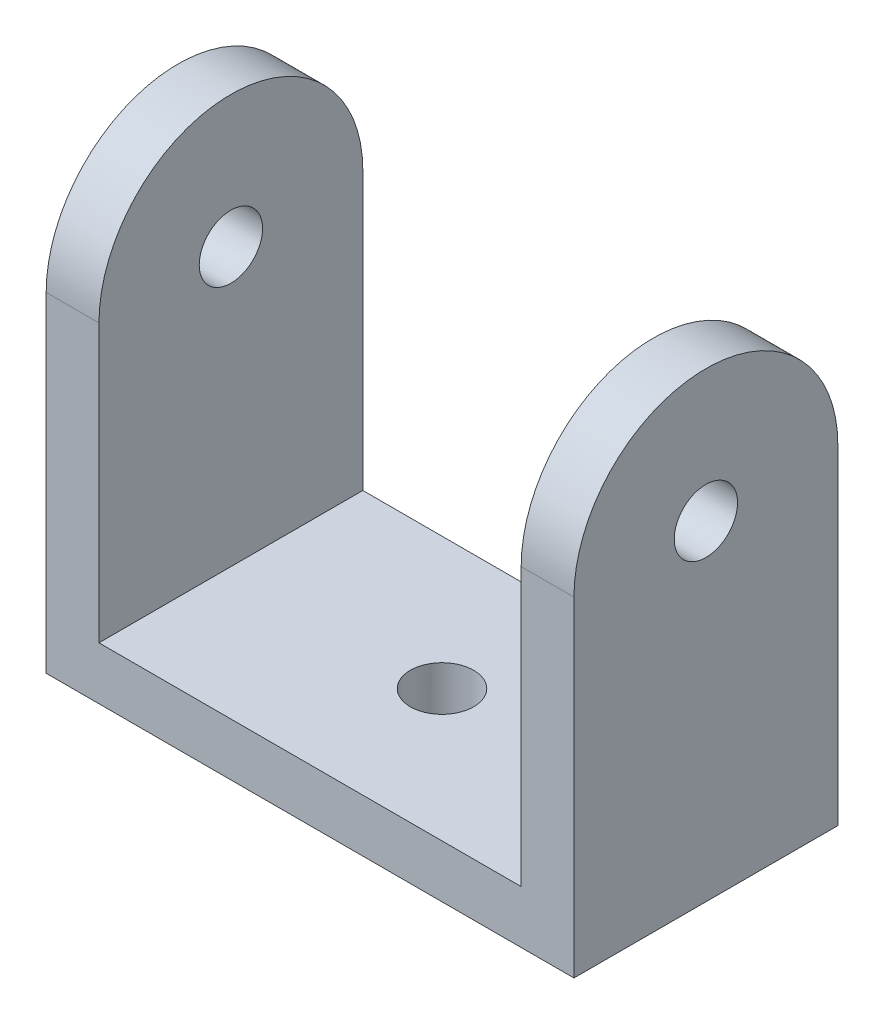
ISO-10303-21;
HEADER;
FILE_DESCRIPTION(('STEP AP214'),'2;1');
FILE_NAME('part.step','',(''),(''),'','','');
FILE_SCHEMA(('AUTOMOTIVE_DESIGN { 1 0 10303 214 1 1 1 1 }'));
ENDSEC;
DATA;
#1=APPLICATION_CONTEXT('core data for automotive mechanical design processes');
#2=APPLICATION_PROTOCOL_DEFINITION('international standard','automotive_design',2000,#1);
#3=PRODUCT_CONTEXT('',#1,'mechanical');
#4=PRODUCT('Part','Part','',(#3));
#5=PRODUCT_RELATED_PRODUCT_CATEGORY('part','',(#4));
#6=PRODUCT_DEFINITION_FORMATION('','',#4);
#7=PRODUCT_DEFINITION_CONTEXT('part definition',#1,'design');
#8=PRODUCT_DEFINITION('design','',#6,#7);
#9=PRODUCT_DEFINITION_SHAPE('','',#8);
#10=(LENGTH_UNIT() NAMED_UNIT(*) SI_UNIT(.MILLI.,.METRE.));
#11=(NAMED_UNIT(*) PLANE_ANGLE_UNIT() SI_UNIT($,.RADIAN.));
#12=(NAMED_UNIT(*) SI_UNIT($,.STERADIAN.) SOLID_ANGLE_UNIT());
#13=UNCERTAINTY_MEASURE_WITH_UNIT(LENGTH_MEASURE(1.E-05),#10,'distance_accuracy_value','');
#14=(GEOMETRIC_REPRESENTATION_CONTEXT(3) GLOBAL_UNCERTAINTY_ASSIGNED_CONTEXT((#13)) GLOBAL_UNIT_ASSIGNED_CONTEXT((#10,
#11,#12)) REPRESENTATION_CONTEXT('',''));
#15=CARTESIAN_POINT('',(0.,0.,0.));
#16=DIRECTION('',(0.,0.,1.));
#17=DIRECTION('',(1.,0.,0.));
#18=AXIS2_PLACEMENT_3D('',#15,#16,#17);
#19=CARTESIAN_POINT('',(20.,-25.,-10.));
#20=DIRECTION('',(0.,1.,0.));
#21=DIRECTION('',(0.,0.,1.));
#22=AXIS2_PLACEMENT_3D('',#19,#20,#21);
#23=PLANE('',#22);
#24=DIRECTION('',(0.,0.,-1.));
#25=VECTOR('',#24,1.);
#26=CARTESIAN_POINT('',(-20.,-25.,-10.));
#27=LINE('',#26,#25);
#28=CARTESIAN_POINT('',(-20.,-25.,10.));
#29=VERTEX_POINT('',#28);
#30=CARTESIAN_POINT('',(-20.,-25.,-10.));
#31=VERTEX_POINT('',#30);
#32=EDGE_CURVE('E163',#29,#31,#27,.T.);
#33=ORIENTED_EDGE('',*,*,#32,.T.);
#34=DIRECTION('',(-1.,0.,0.));
#35=VECTOR('',#34,1.);
#36=CARTESIAN_POINT('',(20.,-25.,-10.));
#37=LINE('',#36,#35);
#38=CARTESIAN_POINT('',(20.,-25.,-10.));
#39=VERTEX_POINT('',#38);
#40=EDGE_CURVE('E168',#39,#31,#37,.T.);
#41=ORIENTED_EDGE('',*,*,#40,.F.);
#42=DIRECTION('',(0.,0.,-1.));
#43=VECTOR('',#42,1.);
#44=CARTESIAN_POINT('',(20.,-25.,-10.));
#45=LINE('',#44,#43);
#46=CARTESIAN_POINT('',(20.,-25.,10.));
#47=VERTEX_POINT('',#46);
#48=EDGE_CURVE('E158',#47,#39,#45,.T.);
#49=ORIENTED_EDGE('',*,*,#48,.F.);
#50=DIRECTION('',(-1.,0.,0.));
#51=VECTOR('',#50,1.);
#52=CARTESIAN_POINT('',(20.,-25.,10.));
#53=LINE('',#52,#51);
#54=EDGE_CURVE('E171',#47,#29,#53,.T.);
#55=ORIENTED_EDGE('',*,*,#54,.T.);
#56=EDGE_LOOP('',(#33,#41,#49,#55));
#57=FACE_BOUND('',#56,.T.);
#58=CARTESIAN_POINT('',(0.,-25.000012,0.));
#59=DIRECTION('',(0.,-1.,0.));
#60=DIRECTION('',(0.,0.,-1.));
#61=AXIS2_PLACEMENT_3D('',#58,#59,#60);
#62=CIRCLE('',#61,2.4);
#63=CARTESIAN_POINT('',(0.,-25.000012,-2.4));
#64=VERTEX_POINT('',#63);
#65=EDGE_CURVE('E185',#64,#64,#62,.T.);
#66=ORIENTED_EDGE('',*,*,#65,.F.);
#67=EDGE_LOOP('',(#66));
#68=FACE_BOUND('',#67,.T.);
#69=ADVANCED_FACE('F41',(#57,#68),#23,.F.);
#70=CARTESIAN_POINT('',(20.,0.,0.));
#71=DIRECTION('',(-1.,0.,0.));
#72=DIRECTION('',(0.,0.,1.));
#73=AXIS2_PLACEMENT_3D('',#70,#71,#72);
#74=CYLINDRICAL_SURFACE('',#73,10.);
#75=CARTESIAN_POINT('',(-16.,0.,0.));
#76=DIRECTION('',(-1.,0.,0.));
#77=DIRECTION('',(0.,0.,1.));
#78=AXIS2_PLACEMENT_3D('',#75,#76,#77);
#79=CIRCLE('',#78,10.);
#80=CARTESIAN_POINT('',(-16.,0.,-10.));
#81=VERTEX_POINT('',#80);
#82=CARTESIAN_POINT('',(-16.,0.,10.));
#83=VERTEX_POINT('',#82);
#84=EDGE_CURVE('E144',#81,#83,#79,.F.);
#85=ORIENTED_EDGE('',*,*,#84,.F.);
#86=DIRECTION('',(-1.,0.,0.));
#87=VECTOR('',#86,1.);
#88=CARTESIAN_POINT('',(20.,0.,-10.));
#89=LINE('',#88,#87);
#90=CARTESIAN_POINT('',(-20.,0.,-10.));
#91=VERTEX_POINT('',#90);
#92=EDGE_CURVE('E93',#81,#91,#89,.T.);
#93=ORIENTED_EDGE('',*,*,#92,.T.);
#94=CARTESIAN_POINT('',(-20.,0.,0.));
#95=DIRECTION('',(1.,0.,0.));
#96=DIRECTION('',(0.,0.,1.));
#97=AXIS2_PLACEMENT_3D('',#94,#95,#96);
#98=CIRCLE('',#97,10.);
#99=CARTESIAN_POINT('',(-20.,0.,10.));
#100=VERTEX_POINT('',#99);
#101=EDGE_CURVE('E147',#91,#100,#98,.T.);
#102=ORIENTED_EDGE('',*,*,#101,.T.);
#103=DIRECTION('',(-1.,0.,0.));
#104=VECTOR('',#103,1.);
#105=CARTESIAN_POINT('',(20.,0.,10.));
#106=LINE('',#105,#104);
#107=EDGE_CURVE('E55',#83,#100,#106,.T.);
#108=ORIENTED_EDGE('',*,*,#107,.F.);
#109=EDGE_LOOP('',(#85,#93,#102,#108));
#110=FACE_BOUND('',#109,.T.);
#111=ADVANCED_FACE('F234',(#110),#74,.T.);
#112=CARTESIAN_POINT('',(20.,-25.,10.));
#113=DIRECTION('',(0.,0.,-1.));
#114=DIRECTION('',(0.,1.,0.));
#115=AXIS2_PLACEMENT_3D('',#112,#113,#114);
#116=PLANE('',#115);
#117=DIRECTION('',(0.,-1.,0.));
#118=VECTOR('',#117,1.);
#119=CARTESIAN_POINT('',(-16.,0.,10.));
#120=LINE('',#119,#118);
#121=CARTESIAN_POINT('',(-16.,-21.,10.));
#122=VERTEX_POINT('',#121);
#123=EDGE_CURVE('E127',#83,#122,#120,.T.);
#124=ORIENTED_EDGE('',*,*,#123,.F.);
#125=ORIENTED_EDGE('',*,*,#107,.T.);
#126=DIRECTION('',(0.,-1.,0.));
#127=VECTOR('',#126,1.);
#128=CARTESIAN_POINT('',(-20.,-25.,10.));
#129=LINE('',#128,#127);
#130=EDGE_CURVE('E165',#100,#29,#129,.T.);
#131=ORIENTED_EDGE('',*,*,#130,.T.);
#132=ORIENTED_EDGE('',*,*,#54,.F.);
#133=DIRECTION('',(0.,-1.,0.));
#134=VECTOR('',#133,1.);
#135=CARTESIAN_POINT('',(20.,-25.,10.));
#136=LINE('',#135,#134);
#137=CARTESIAN_POINT('',(20.,0.,10.));
#138=VERTEX_POINT('',#137);
#139=EDGE_CURVE('E98',#138,#47,#136,.T.);
#140=ORIENTED_EDGE('',*,*,#139,.F.);
#141=CARTESIAN_POINT('',(16.,0.,10.));
#142=VERTEX_POINT('',#141);
#143=EDGE_CURVE('E11',#138,#142,#106,.T.);
#144=ORIENTED_EDGE('',*,*,#143,.T.);
#145=DIRECTION('',(0.,-1.,0.));
#146=VECTOR('',#145,1.);
#147=CARTESIAN_POINT('',(16.,0.,10.));
#148=LINE('',#147,#146);
#149=CARTESIAN_POINT('',(16.,-21.,10.));
#150=VERTEX_POINT('',#149);
#151=EDGE_CURVE('E143',#142,#150,#148,.T.);
#152=ORIENTED_EDGE('',*,*,#151,.T.);
#153=DIRECTION('',(-1.,0.,0.));
#154=VECTOR('',#153,1.);
#155=CARTESIAN_POINT('',(20.,-21.,10.));
#156=LINE('',#155,#154);
#157=EDGE_CURVE('E134',#150,#122,#156,.T.);
#158=ORIENTED_EDGE('',*,*,#157,.T.);
#159=EDGE_LOOP('',(#124,#125,#131,#132,#140,#144,#152,#158));
#160=FACE_BOUND('',#159,.T.);
#161=ADVANCED_FACE('F229',(#160),#116,.F.);
#162=CARTESIAN_POINT('',(20.,0.,-10.));
#163=DIRECTION('',(0.,0.,1.));
#164=DIRECTION('',(0.,-1.,0.));
#165=AXIS2_PLACEMENT_3D('',#162,#163,#164);
#166=PLANE('',#165);
#167=DIRECTION('',(0.,1.,0.));
#168=VECTOR('',#167,1.);
#169=CARTESIAN_POINT('',(-16.,0.,-10.));
#170=LINE('',#169,#168);
#171=CARTESIAN_POINT('',(-16.,-21.,-10.));
#172=VERTEX_POINT('',#171);
#173=EDGE_CURVE('E123',#172,#81,#170,.T.);
#174=ORIENTED_EDGE('',*,*,#173,.F.);
#175=DIRECTION('',(-1.,0.,0.));
#176=VECTOR('',#175,1.);
#177=CARTESIAN_POINT('',(20.,-21.,-10.));
#178=LINE('',#177,#176);
#179=CARTESIAN_POINT('',(16.,-21.,-10.));
#180=VERTEX_POINT('',#179);
#181=EDGE_CURVE('E133',#180,#172,#178,.T.);
#182=ORIENTED_EDGE('',*,*,#181,.F.);
#183=DIRECTION('',(0.,1.,0.));
#184=VECTOR('',#183,1.);
#185=CARTESIAN_POINT('',(16.,0.,-10.));
#186=LINE('',#185,#184);
#187=CARTESIAN_POINT('',(16.,0.,-10.));
#188=VERTEX_POINT('',#187);
#189=EDGE_CURVE('E58',#180,#188,#186,.T.);
#190=ORIENTED_EDGE('',*,*,#189,.T.);
#191=CARTESIAN_POINT('',(20.,0.,-10.));
#192=VERTEX_POINT('',#191);
#193=EDGE_CURVE('E170',#192,#188,#89,.T.);
#194=ORIENTED_EDGE('',*,*,#193,.F.);
#195=DIRECTION('',(0.,1.,0.));
#196=VECTOR('',#195,1.);
#197=CARTESIAN_POINT('',(20.,0.,-10.));
#198=LINE('',#197,#196);
#199=EDGE_CURVE('E68',#39,#192,#198,.T.);
#200=ORIENTED_EDGE('',*,*,#199,.F.);
#201=ORIENTED_EDGE('',*,*,#40,.T.);
#202=DIRECTION('',(0.,1.,0.));
#203=VECTOR('',#202,1.);
#204=CARTESIAN_POINT('',(-20.,0.,-10.));
#205=LINE('',#204,#203);
#206=EDGE_CURVE('E156',#31,#91,#205,.T.);
#207=ORIENTED_EDGE('',*,*,#206,.T.);
#208=ORIENTED_EDGE('',*,*,#92,.F.);
#209=EDGE_LOOP('',(#174,#182,#190,#194,#200,#201,#207,#208));
#210=FACE_BOUND('',#209,.T.);
#211=ADVANCED_FACE('F137',(#210),#166,.F.);
#212=ORIENTED_EDGE('',*,*,#193,.T.);
#213=CARTESIAN_POINT('',(16.,0.,0.));
#214=DIRECTION('',(-1.,0.,0.));
#215=DIRECTION('',(0.,0.,1.));
#216=AXIS2_PLACEMENT_3D('',#213,#214,#215);
#217=CIRCLE('',#216,10.);
#218=EDGE_CURVE('E139',#188,#142,#217,.F.);
#219=ORIENTED_EDGE('',*,*,#218,.T.);
#220=ORIENTED_EDGE('',*,*,#143,.F.);
#221=CARTESIAN_POINT('',(20.,0.,0.));
#222=DIRECTION('',(1.,0.,0.));
#223=DIRECTION('',(0.,0.,1.));
#224=AXIS2_PLACEMENT_3D('',#221,#222,#223);
#225=CIRCLE('',#224,10.);
#226=EDGE_CURVE('E152',#192,#138,#225,.T.);
#227=ORIENTED_EDGE('',*,*,#226,.F.);
#228=EDGE_LOOP('',(#212,#219,#220,#227));
#229=FACE_BOUND('',#228,.T.);
#230=ADVANCED_FACE('F43',(#229),#74,.T.);
#231=CARTESIAN_POINT('',(20.,0.,0.));
#232=DIRECTION('',(-1.,0.,0.));
#233=DIRECTION('',(0.,0.,1.));
#234=AXIS2_PLACEMENT_3D('',#231,#232,#233);
#235=PLANE('',#234);
#236=CARTESIAN_POINT('',(20.,0.,0.));
#237=DIRECTION('',(1.,0.,0.));
#238=DIRECTION('',(0.,0.,-1.));
#239=AXIS2_PLACEMENT_3D('',#236,#237,#238);
#240=CIRCLE('',#239,2.4);
#241=CARTESIAN_POINT('',(20.,0.,-2.4));
#242=VERTEX_POINT('',#241);
#243=EDGE_CURVE('E183',#242,#242,#240,.T.);
#244=ORIENTED_EDGE('',*,*,#243,.F.);
#245=EDGE_LOOP('',(#244));
#246=FACE_BOUND('',#245,.T.);
#247=ORIENTED_EDGE('',*,*,#226,.T.);
#248=ORIENTED_EDGE('',*,*,#139,.T.);
#249=ORIENTED_EDGE('',*,*,#48,.T.);
#250=ORIENTED_EDGE('',*,*,#199,.T.);
#251=EDGE_LOOP('',(#247,#248,#249,#250));
#252=FACE_BOUND('',#251,.T.);
#253=ADVANCED_FACE('F225',(#246,#252),#235,.F.);
#254=CARTESIAN_POINT('',(-20.,0.,0.));
#255=DIRECTION('',(-1.,0.,0.));
#256=DIRECTION('',(0.,0.,1.));
#257=AXIS2_PLACEMENT_3D('',#254,#255,#256);
#258=PLANE('',#257);
#259=CARTESIAN_POINT('',(-20.,0.,0.));
#260=DIRECTION('',(1.,0.,0.));
#261=DIRECTION('',(0.,0.,-1.));
#262=AXIS2_PLACEMENT_3D('',#259,#260,#261);
#263=CIRCLE('',#262,2.4);
#264=CARTESIAN_POINT('',(-20.,0.,-2.4));
#265=VERTEX_POINT('',#264);
#266=EDGE_CURVE('E179',#265,#265,#263,.T.);
#267=ORIENTED_EDGE('',*,*,#266,.T.);
#268=EDGE_LOOP('',(#267));
#269=FACE_BOUND('',#268,.T.);
#270=ORIENTED_EDGE('',*,*,#101,.F.);
#271=ORIENTED_EDGE('',*,*,#206,.F.);
#272=ORIENTED_EDGE('',*,*,#32,.F.);
#273=ORIENTED_EDGE('',*,*,#130,.F.);
#274=EDGE_LOOP('',(#270,#271,#272,#273));
#275=FACE_BOUND('',#274,.T.);
#276=ADVANCED_FACE('F214',(#269,#275),#258,.T.);
#277=CARTESIAN_POINT('',(20.,-21.,-10.));
#278=DIRECTION('',(0.,1.,0.));
#279=DIRECTION('',(0.,0.,1.));
#280=AXIS2_PLACEMENT_3D('',#277,#278,#279);
#281=PLANE('',#280);
#282=CARTESIAN_POINT('',(0.,-21.,0.));
#283=DIRECTION('',(0.,1.,0.));
#284=DIRECTION('',(0.,0.,1.));
#285=AXIS2_PLACEMENT_3D('',#282,#283,#284);
#286=CIRCLE('',#285,2.4);
#287=CARTESIAN_POINT('',(0.,-21.,2.4));
#288=VERTEX_POINT('',#287);
#289=EDGE_CURVE('E188',#288,#288,#286,.F.);
#290=ORIENTED_EDGE('',*,*,#289,.T.);
#291=EDGE_LOOP('',(#290));
#292=FACE_BOUND('',#291,.T.);
#293=DIRECTION('',(0.,0.,-1.));
#294=VECTOR('',#293,1.);
#295=CARTESIAN_POINT('',(-16.,-21.,0.));
#296=LINE('',#295,#294);
#297=EDGE_CURVE('E119',#122,#172,#296,.T.);
#298=ORIENTED_EDGE('',*,*,#297,.F.);
#299=ORIENTED_EDGE('',*,*,#157,.F.);
#300=DIRECTION('',(0.,0.,-1.));
#301=VECTOR('',#300,1.);
#302=CARTESIAN_POINT('',(16.,-21.,0.));
#303=LINE('',#302,#301);
#304=EDGE_CURVE('E131',#150,#180,#303,.T.);
#305=ORIENTED_EDGE('',*,*,#304,.T.);
#306=ORIENTED_EDGE('',*,*,#181,.T.);
#307=EDGE_LOOP('',(#298,#299,#305,#306));
#308=FACE_BOUND('',#307,.T.);
#309=ADVANCED_FACE('F135',(#292,#308),#281,.T.);
#310=CARTESIAN_POINT('',(16.,0.,0.));
#311=DIRECTION('',(-1.,0.,0.));
#312=DIRECTION('',(0.,0.,1.));
#313=AXIS2_PLACEMENT_3D('',#310,#311,#312);
#314=PLANE('',#313);
#315=CARTESIAN_POINT('',(16.,0.,0.));
#316=DIRECTION('',(-1.,0.,0.));
#317=DIRECTION('',(0.,0.,1.));
#318=AXIS2_PLACEMENT_3D('',#315,#316,#317);
#319=CIRCLE('',#318,2.4);
#320=CARTESIAN_POINT('',(16.,0.,2.4));
#321=VERTEX_POINT('',#320);
#322=EDGE_CURVE('E150',#321,#321,#319,.T.);
#323=ORIENTED_EDGE('',*,*,#322,.F.);
#324=EDGE_LOOP('',(#323));
#325=FACE_BOUND('',#324,.T.);
#326=ORIENTED_EDGE('',*,*,#218,.F.);
#327=ORIENTED_EDGE('',*,*,#189,.F.);
#328=ORIENTED_EDGE('',*,*,#304,.F.);
#329=ORIENTED_EDGE('',*,*,#151,.F.);
#330=EDGE_LOOP('',(#326,#327,#328,#329));
#331=FACE_BOUND('',#330,.T.);
#332=ADVANCED_FACE('F212',(#325,#331),#314,.T.);
#333=CARTESIAN_POINT('',(-16.,0.,0.));
#334=DIRECTION('',(-1.,0.,0.));
#335=DIRECTION('',(0.,0.,1.));
#336=AXIS2_PLACEMENT_3D('',#333,#334,#335);
#337=PLANE('',#336);
#338=CARTESIAN_POINT('',(-16.,0.,0.));
#339=DIRECTION('',(-1.,0.,0.));
#340=DIRECTION('',(0.,0.,1.));
#341=AXIS2_PLACEMENT_3D('',#338,#339,#340);
#342=CIRCLE('',#341,2.4);
#343=CARTESIAN_POINT('',(-16.,0.,2.4));
#344=VERTEX_POINT('',#343);
#345=EDGE_CURVE('E176',#344,#344,#342,.T.);
#346=ORIENTED_EDGE('',*,*,#345,.T.);
#347=EDGE_LOOP('',(#346));
#348=FACE_BOUND('',#347,.T.);
#349=ORIENTED_EDGE('',*,*,#84,.T.);
#350=ORIENTED_EDGE('',*,*,#123,.T.);
#351=ORIENTED_EDGE('',*,*,#297,.T.);
#352=ORIENTED_EDGE('',*,*,#173,.T.);
#353=EDGE_LOOP('',(#349,#350,#351,#352));
#354=FACE_BOUND('',#353,.T.);
#355=ADVANCED_FACE('F122',(#348,#354),#337,.F.);
#356=CARTESIAN_POINT('',(-20.,0.,0.));
#357=DIRECTION('',(1.,0.,0.));
#358=DIRECTION('',(0.,0.,-1.));
#359=AXIS2_PLACEMENT_3D('',#356,#357,#358);
#360=CYLINDRICAL_SURFACE('',#359,2.4);
#361=ORIENTED_EDGE('',*,*,#266,.F.);
#362=EDGE_LOOP('',(#361));
#363=FACE_BOUND('',#362,.T.);
#364=ORIENTED_EDGE('',*,*,#345,.F.);
#365=EDGE_LOOP('',(#364));
#366=FACE_BOUND('',#365,.T.);
#367=ADVANCED_FACE('F209',(#363,#366),#360,.F.);
#368=ORIENTED_EDGE('',*,*,#322,.T.);
#369=EDGE_LOOP('',(#368));
#370=FACE_BOUND('',#369,.T.);
#371=ORIENTED_EDGE('',*,*,#243,.T.);
#372=EDGE_LOOP('',(#371));
#373=FACE_BOUND('',#372,.T.);
#374=ADVANCED_FACE('F210',(#370,#373),#360,.F.);
#375=CARTESIAN_POINT('',(0.,-25.000012,0.));
#376=DIRECTION('',(0.,1.,0.));
#377=DIRECTION('',(0.,0.,1.));
#378=AXIS2_PLACEMENT_3D('',#375,#376,#377);
#379=CYLINDRICAL_SURFACE('',#378,2.4);
#380=ORIENTED_EDGE('',*,*,#65,.T.);
#381=EDGE_LOOP('',(#380));
#382=FACE_BOUND('',#381,.T.);
#383=ORIENTED_EDGE('',*,*,#289,.F.);
#384=EDGE_LOOP('',(#383));
#385=FACE_BOUND('',#384,.T.);
#386=ADVANCED_FACE('F196',(#382,#385),#379,.F.);
#387=CLOSED_SHELL('',(#69,#111,#161,#211,#230,#253,#276,#309,#332,#355,#367,#374,#386));
#388=MANIFOLD_SOLID_BREP('B2',#387);
#389=ADVANCED_BREP_SHAPE_REPRESENTATION('',(#18,#388),#14);
#390=SHAPE_DEFINITION_REPRESENTATION(#9,#389);
ENDSEC;
END-ISO-10303-21;
